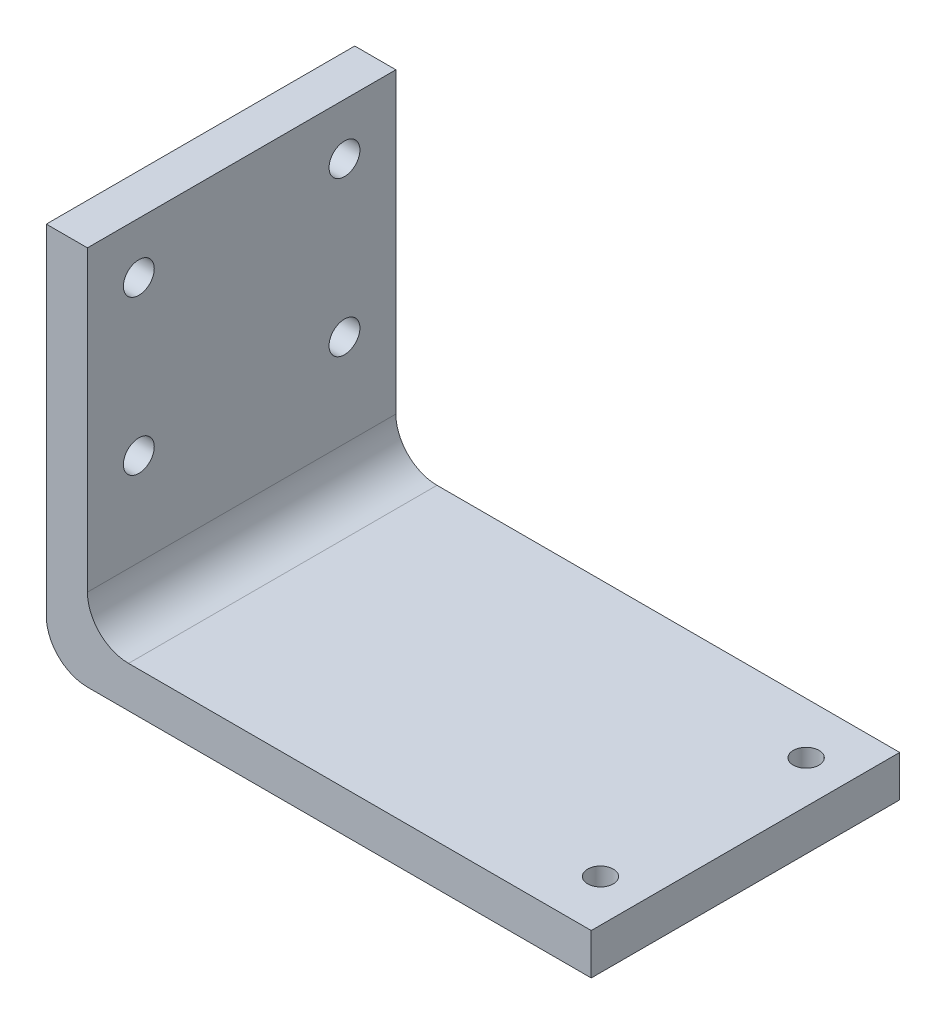
ISO-10303-21;
HEADER;
FILE_DESCRIPTION(('STEP AP214'),'2;1');
FILE_NAME('part.step','',(''),(''),'','','');
FILE_SCHEMA(('AUTOMOTIVE_DESIGN { 1 0 10303 214 1 1 1 1 }'));
ENDSEC;
DATA;
#1=APPLICATION_CONTEXT('core data for automotive mechanical design processes');
#2=APPLICATION_PROTOCOL_DEFINITION('international standard','automotive_design',2000,#1);
#3=PRODUCT_CONTEXT('',#1,'mechanical');
#4=PRODUCT('Part','Part','',(#3));
#5=PRODUCT_RELATED_PRODUCT_CATEGORY('part','',(#4));
#6=PRODUCT_DEFINITION_FORMATION('','',#4);
#7=PRODUCT_DEFINITION_CONTEXT('part definition',#1,'design');
#8=PRODUCT_DEFINITION('design','',#6,#7);
#9=PRODUCT_DEFINITION_SHAPE('','',#8);
#10=(LENGTH_UNIT() NAMED_UNIT(*) SI_UNIT(.MILLI.,.METRE.));
#11=(NAMED_UNIT(*) PLANE_ANGLE_UNIT() SI_UNIT($,.RADIAN.));
#12=(NAMED_UNIT(*) SI_UNIT($,.STERADIAN.) SOLID_ANGLE_UNIT());
#13=UNCERTAINTY_MEASURE_WITH_UNIT(LENGTH_MEASURE(1.E-05),#10,'distance_accuracy_value','');
#14=(GEOMETRIC_REPRESENTATION_CONTEXT(3) GLOBAL_UNCERTAINTY_ASSIGNED_CONTEXT((#13)) GLOBAL_UNIT_ASSIGNED_CONTEXT((#10,
#11,#12)) REPRESENTATION_CONTEXT('',''));
#15=CARTESIAN_POINT('',(0.,0.,0.));
#16=DIRECTION('',(0.,0.,1.));
#17=DIRECTION('',(1.,0.,0.));
#18=AXIS2_PLACEMENT_3D('',#15,#16,#17);
#19=CARTESIAN_POINT('',(67.31,0.,38.1));
#20=DIRECTION('',(-1.,0.,0.));
#21=DIRECTION('',(0.,0.,1.));
#22=AXIS2_PLACEMENT_3D('',#19,#20,#21);
#23=PLANE('',#22);
#24=DIRECTION('',(0.,1.,0.));
#25=VECTOR('',#24,1.);
#26=CARTESIAN_POINT('',(67.31,0.,0.));
#27=LINE('',#26,#25);
#28=CARTESIAN_POINT('',(67.31,0.,0.));
#29=VERTEX_POINT('',#28);
#30=CARTESIAN_POINT('',(67.31,5.08,0.));
#31=VERTEX_POINT('',#30);
#32=EDGE_CURVE('E140',#29,#31,#27,.T.);
#33=ORIENTED_EDGE('',*,*,#32,.T.);
#34=DIRECTION('',(0.,0.,-1.));
#35=VECTOR('',#34,1.);
#36=CARTESIAN_POINT('',(67.31,5.08,38.1));
#37=LINE('',#36,#35);
#38=CARTESIAN_POINT('',(67.31,5.08,38.1));
#39=VERTEX_POINT('',#38);
#40=EDGE_CURVE('E11',#39,#31,#37,.T.);
#41=ORIENTED_EDGE('',*,*,#40,.F.);
#42=DIRECTION('',(0.,1.,0.));
#43=VECTOR('',#42,1.);
#44=CARTESIAN_POINT('',(67.31,0.,38.1));
#45=LINE('',#44,#43);
#46=CARTESIAN_POINT('',(67.31,0.,38.1));
#47=VERTEX_POINT('',#46);
#48=EDGE_CURVE('E163',#47,#39,#45,.T.);
#49=ORIENTED_EDGE('',*,*,#48,.F.);
#50=DIRECTION('',(0.,0.,-1.));
#51=VECTOR('',#50,1.);
#52=CARTESIAN_POINT('',(67.31,0.,38.1));
#53=LINE('',#52,#51);
#54=EDGE_CURVE('E136',#47,#29,#53,.T.);
#55=ORIENTED_EDGE('',*,*,#54,.T.);
#56=EDGE_LOOP('',(#33,#41,#49,#55));
#57=FACE_BOUND('',#56,.T.);
#58=ADVANCED_FACE('F39',(#57),#23,.F.);
#59=CARTESIAN_POINT('',(10.16,5.08,38.1));
#60=DIRECTION('',(0.,-1.,0.));
#61=DIRECTION('',(0.,0.,-1.));
#62=AXIS2_PLACEMENT_3D('',#59,#60,#61);
#63=PLANE('',#62);
#64=CARTESIAN_POINT('',(62.103,5.08,31.75));
#65=DIRECTION('',(0.,1.,0.));
#66=DIRECTION('',(0.,0.,1.));
#67=AXIS2_PLACEMENT_3D('',#64,#65,#66);
#68=CIRCLE('',#67,1.58750000000001);
#69=CARTESIAN_POINT('',(62.103,5.08,33.3375));
#70=VERTEX_POINT('',#69);
#71=EDGE_CURVE('E215',#70,#70,#68,.T.);
#72=ORIENTED_EDGE('',*,*,#71,.F.);
#73=EDGE_LOOP('',(#72));
#74=FACE_BOUND('',#73,.T.);
#75=CARTESIAN_POINT('',(62.103,5.08,6.35));
#76=DIRECTION('',(0.,1.,0.));
#77=DIRECTION('',(0.,0.,1.));
#78=AXIS2_PLACEMENT_3D('',#75,#76,#77);
#79=CIRCLE('',#78,1.58750000000001);
#80=CARTESIAN_POINT('',(62.103,5.08,7.93750000000001));
#81=VERTEX_POINT('',#80);
#82=EDGE_CURVE('E207',#81,#81,#79,.T.);
#83=ORIENTED_EDGE('',*,*,#82,.F.);
#84=EDGE_LOOP('',(#83));
#85=FACE_BOUND('',#84,.T.);
#86=DIRECTION('',(-1.,0.,0.));
#87=VECTOR('',#86,1.);
#88=CARTESIAN_POINT('',(10.16,5.08,0.));
#89=LINE('',#88,#87);
#90=CARTESIAN_POINT('',(10.16,5.08,0.));
#91=VERTEX_POINT('',#90);
#92=EDGE_CURVE('E144',#31,#91,#89,.T.);
#93=ORIENTED_EDGE('',*,*,#92,.T.);
#94=DIRECTION('',(0.,0.,-1.));
#95=VECTOR('',#94,1.);
#96=CARTESIAN_POINT('',(10.16,5.08,38.1));
#97=LINE('',#96,#95);
#98=CARTESIAN_POINT('',(10.16,5.08,38.1));
#99=VERTEX_POINT('',#98);
#100=EDGE_CURVE('E48',#99,#91,#97,.T.);
#101=ORIENTED_EDGE('',*,*,#100,.F.);
#102=DIRECTION('',(-1.,0.,0.));
#103=VECTOR('',#102,1.);
#104=CARTESIAN_POINT('',(10.16,5.08,38.1));
#105=LINE('',#104,#103);
#106=EDGE_CURVE('E99',#39,#99,#105,.T.);
#107=ORIENTED_EDGE('',*,*,#106,.F.);
#108=ORIENTED_EDGE('',*,*,#40,.T.);
#109=EDGE_LOOP('',(#93,#101,#107,#108));
#110=FACE_BOUND('',#109,.T.);
#111=ADVANCED_FACE('F283',(#74,#85,#110),#63,.F.);
#112=CARTESIAN_POINT('',(10.16,10.16,38.1));
#113=DIRECTION('',(0.,0.,-1.));
#114=DIRECTION('',(-1.,0.,0.));
#115=AXIS2_PLACEMENT_3D('',#112,#113,#114);
#116=CYLINDRICAL_SURFACE('',#115,5.08);
#117=CARTESIAN_POINT('',(10.16,10.16,0.));
#118=DIRECTION('',(0.,0.,-1.));
#119=DIRECTION('',(-1.,0.,0.));
#120=AXIS2_PLACEMENT_3D('',#117,#118,#119);
#121=CIRCLE('',#120,5.08);
#122=CARTESIAN_POINT('',(5.08,10.16,0.));
#123=VERTEX_POINT('',#122);
#124=EDGE_CURVE('E148',#91,#123,#121,.T.);
#125=ORIENTED_EDGE('',*,*,#124,.T.);
#126=DIRECTION('',(0.,0.,-1.));
#127=VECTOR('',#126,1.);
#128=CARTESIAN_POINT('',(5.08,10.16,38.1));
#129=LINE('',#128,#127);
#130=CARTESIAN_POINT('',(5.08,10.16,38.1));
#131=VERTEX_POINT('',#130);
#132=EDGE_CURVE('E174',#131,#123,#129,.T.);
#133=ORIENTED_EDGE('',*,*,#132,.F.);
#134=CARTESIAN_POINT('',(10.16,10.16,38.1));
#135=DIRECTION('',(0.,0.,-1.));
#136=DIRECTION('',(-1.,0.,0.));
#137=AXIS2_PLACEMENT_3D('',#134,#135,#136);
#138=CIRCLE('',#137,5.08);
#139=EDGE_CURVE('E184',#99,#131,#138,.T.);
#140=ORIENTED_EDGE('',*,*,#139,.F.);
#141=ORIENTED_EDGE('',*,*,#100,.T.);
#142=EDGE_LOOP('',(#125,#133,#140,#141));
#143=FACE_BOUND('',#142,.T.);
#144=ADVANCED_FACE('F182',(#143),#116,.F.);
#145=CARTESIAN_POINT('',(5.08,10.16,38.1));
#146=DIRECTION('',(-1.,0.,0.));
#147=DIRECTION('',(0.,0.,1.));
#148=AXIS2_PLACEMENT_3D('',#145,#146,#147);
#149=PLANE('',#148);
#150=CARTESIAN_POINT('',(5.08,40.64,31.75));
#151=DIRECTION('',(1.,0.,0.));
#152=DIRECTION('',(0.,0.,-1.));
#153=AXIS2_PLACEMENT_3D('',#150,#151,#152);
#154=CIRCLE('',#153,1.905);
#155=CARTESIAN_POINT('',(5.08,40.64,29.845));
#156=VERTEX_POINT('',#155);
#157=EDGE_CURVE('E247',#156,#156,#154,.T.);
#158=ORIENTED_EDGE('',*,*,#157,.F.);
#159=EDGE_LOOP('',(#158));
#160=FACE_BOUND('',#159,.T.);
#161=CARTESIAN_POINT('',(5.08,40.64,6.35));
#162=DIRECTION('',(1.,0.,0.));
#163=DIRECTION('',(0.,0.,-1.));
#164=AXIS2_PLACEMENT_3D('',#161,#162,#163);
#165=CIRCLE('',#164,1.905);
#166=CARTESIAN_POINT('',(5.08,40.64,4.445));
#167=VERTEX_POINT('',#166);
#168=EDGE_CURVE('E239',#167,#167,#165,.T.);
#169=ORIENTED_EDGE('',*,*,#168,.F.);
#170=EDGE_LOOP('',(#169));
#171=FACE_BOUND('',#170,.T.);
#172=CARTESIAN_POINT('',(5.08,21.59,6.35));
#173=DIRECTION('',(1.,0.,0.));
#174=DIRECTION('',(0.,0.,-1.));
#175=AXIS2_PLACEMENT_3D('',#172,#173,#174);
#176=CIRCLE('',#175,1.905);
#177=CARTESIAN_POINT('',(5.08,21.59,4.445));
#178=VERTEX_POINT('',#177);
#179=EDGE_CURVE('E231',#178,#178,#176,.T.);
#180=ORIENTED_EDGE('',*,*,#179,.F.);
#181=EDGE_LOOP('',(#180));
#182=FACE_BOUND('',#181,.T.);
#183=CARTESIAN_POINT('',(5.08,21.59,31.75));
#184=DIRECTION('',(1.,0.,0.));
#185=DIRECTION('',(0.,0.,-1.));
#186=AXIS2_PLACEMENT_3D('',#183,#184,#185);
#187=CIRCLE('',#186,1.905);
#188=CARTESIAN_POINT('',(5.08,21.59,29.845));
#189=VERTEX_POINT('',#188);
#190=EDGE_CURVE('E223',#189,#189,#187,.T.);
#191=ORIENTED_EDGE('',*,*,#190,.F.);
#192=EDGE_LOOP('',(#191));
#193=FACE_BOUND('',#192,.T.);
#194=DIRECTION('',(0.,1.,0.));
#195=VECTOR('',#194,1.);
#196=CARTESIAN_POINT('',(5.08,10.16,0.));
#197=LINE('',#196,#195);
#198=CARTESIAN_POINT('',(5.08,46.99,0.));
#199=VERTEX_POINT('',#198);
#200=EDGE_CURVE('E151',#123,#199,#197,.T.);
#201=ORIENTED_EDGE('',*,*,#200,.T.);
#202=DIRECTION('',(0.,0.,-1.));
#203=VECTOR('',#202,1.);
#204=CARTESIAN_POINT('',(5.08,46.99,38.1));
#205=LINE('',#204,#203);
#206=CARTESIAN_POINT('',(5.08,46.99,38.1));
#207=VERTEX_POINT('',#206);
#208=EDGE_CURVE('E170',#207,#199,#205,.T.);
#209=ORIENTED_EDGE('',*,*,#208,.F.);
#210=DIRECTION('',(0.,1.,0.));
#211=VECTOR('',#210,1.);
#212=CARTESIAN_POINT('',(5.08,10.16,38.1));
#213=LINE('',#212,#211);
#214=EDGE_CURVE('E197',#131,#207,#213,.T.);
#215=ORIENTED_EDGE('',*,*,#214,.F.);
#216=ORIENTED_EDGE('',*,*,#132,.T.);
#217=EDGE_LOOP('',(#201,#209,#215,#216));
#218=FACE_BOUND('',#217,.T.);
#219=ADVANCED_FACE('F192',(#160,#171,#182,#193,#218),#149,.F.);
#220=CARTESIAN_POINT('',(0.,46.99,38.1));
#221=DIRECTION('',(0.,-1.,0.));
#222=DIRECTION('',(1.,0.,0.));
#223=AXIS2_PLACEMENT_3D('',#220,#221,#222);
#224=PLANE('',#223);
#225=DIRECTION('',(-1.,0.,0.));
#226=VECTOR('',#225,1.);
#227=CARTESIAN_POINT('',(0.,46.99,0.));
#228=LINE('',#227,#226);
#229=CARTESIAN_POINT('',(0.,46.99,0.));
#230=VERTEX_POINT('',#229);
#231=EDGE_CURVE('E154',#199,#230,#228,.T.);
#232=ORIENTED_EDGE('',*,*,#231,.T.);
#233=DIRECTION('',(0.,0.,-1.));
#234=VECTOR('',#233,1.);
#235=CARTESIAN_POINT('',(0.,46.99,38.1));
#236=LINE('',#235,#234);
#237=CARTESIAN_POINT('',(0.,46.99,38.1));
#238=VERTEX_POINT('',#237);
#239=EDGE_CURVE('E129',#238,#230,#236,.T.);
#240=ORIENTED_EDGE('',*,*,#239,.F.);
#241=DIRECTION('',(-1.,0.,0.));
#242=VECTOR('',#241,1.);
#243=CARTESIAN_POINT('',(0.,46.99,38.1));
#244=LINE('',#243,#242);
#245=EDGE_CURVE('E118',#207,#238,#244,.T.);
#246=ORIENTED_EDGE('',*,*,#245,.F.);
#247=ORIENTED_EDGE('',*,*,#208,.T.);
#248=EDGE_LOOP('',(#232,#240,#246,#247));
#249=FACE_BOUND('',#248,.T.);
#250=ADVANCED_FACE('F195',(#249),#224,.F.);
#251=CARTESIAN_POINT('',(0.,5.08000000000004,38.1));
#252=DIRECTION('',(1.,0.,0.));
#253=DIRECTION('',(0.,0.,-1.));
#254=AXIS2_PLACEMENT_3D('',#251,#252,#253);
#255=PLANE('',#254);
#256=CARTESIAN_POINT('',(0.,40.64,31.75));
#257=DIRECTION('',(1.,0.,0.));
#258=DIRECTION('',(0.,0.,-1.));
#259=AXIS2_PLACEMENT_3D('',#256,#257,#258);
#260=CIRCLE('',#259,1.905);
#261=CARTESIAN_POINT('',(0.,40.64,29.845));
#262=VERTEX_POINT('',#261);
#263=EDGE_CURVE('E243',#262,#262,#260,.F.);
#264=ORIENTED_EDGE('',*,*,#263,.F.);
#265=EDGE_LOOP('',(#264));
#266=FACE_BOUND('',#265,.T.);
#267=CARTESIAN_POINT('',(0.,40.64,6.35));
#268=DIRECTION('',(1.,0.,0.));
#269=DIRECTION('',(0.,0.,-1.));
#270=AXIS2_PLACEMENT_3D('',#267,#268,#269);
#271=CIRCLE('',#270,1.905);
#272=CARTESIAN_POINT('',(0.,40.64,4.445));
#273=VERTEX_POINT('',#272);
#274=EDGE_CURVE('E235',#273,#273,#271,.F.);
#275=ORIENTED_EDGE('',*,*,#274,.F.);
#276=EDGE_LOOP('',(#275));
#277=FACE_BOUND('',#276,.T.);
#278=CARTESIAN_POINT('',(0.,21.59,6.35));
#279=DIRECTION('',(1.,0.,0.));
#280=DIRECTION('',(0.,0.,-1.));
#281=AXIS2_PLACEMENT_3D('',#278,#279,#280);
#282=CIRCLE('',#281,1.905);
#283=CARTESIAN_POINT('',(0.,21.59,4.445));
#284=VERTEX_POINT('',#283);
#285=EDGE_CURVE('E227',#284,#284,#282,.F.);
#286=ORIENTED_EDGE('',*,*,#285,.F.);
#287=EDGE_LOOP('',(#286));
#288=FACE_BOUND('',#287,.T.);
#289=CARTESIAN_POINT('',(0.,21.59,31.75));
#290=DIRECTION('',(1.,0.,0.));
#291=DIRECTION('',(0.,0.,-1.));
#292=AXIS2_PLACEMENT_3D('',#289,#290,#291);
#293=CIRCLE('',#292,1.905);
#294=CARTESIAN_POINT('',(0.,21.59,29.845));
#295=VERTEX_POINT('',#294);
#296=EDGE_CURVE('E219',#295,#295,#293,.F.);
#297=ORIENTED_EDGE('',*,*,#296,.F.);
#298=EDGE_LOOP('',(#297));
#299=FACE_BOUND('',#298,.T.);
#300=DIRECTION('',(0.,-1.,0.));
#301=VECTOR('',#300,1.);
#302=CARTESIAN_POINT('',(0.,5.08000000000004,0.));
#303=LINE('',#302,#301);
#304=CARTESIAN_POINT('',(0.,5.08000000000004,0.));
#305=VERTEX_POINT('',#304);
#306=EDGE_CURVE('E127',#230,#305,#303,.T.);
#307=ORIENTED_EDGE('',*,*,#306,.T.);
#308=DIRECTION('',(0.,0.,-1.));
#309=VECTOR('',#308,1.);
#310=CARTESIAN_POINT('',(0.,5.08000000000004,38.1));
#311=LINE('',#310,#309);
#312=CARTESIAN_POINT('',(0.,5.08000000000004,38.1));
#313=VERTEX_POINT('',#312);
#314=EDGE_CURVE('E124',#313,#305,#311,.T.);
#315=ORIENTED_EDGE('',*,*,#314,.F.);
#316=DIRECTION('',(0.,-1.,0.));
#317=VECTOR('',#316,1.);
#318=CARTESIAN_POINT('',(0.,5.08000000000004,38.1));
#319=LINE('',#318,#317);
#320=EDGE_CURVE('E112',#238,#313,#319,.T.);
#321=ORIENTED_EDGE('',*,*,#320,.F.);
#322=ORIENTED_EDGE('',*,*,#239,.T.);
#323=EDGE_LOOP('',(#307,#315,#321,#322));
#324=FACE_BOUND('',#323,.T.);
#325=ADVANCED_FACE('F125',(#266,#277,#288,#299,#324),#255,.F.);
#326=CARTESIAN_POINT('',(5.08,5.08,38.1));
#327=DIRECTION('',(0.,0.,-1.));
#328=DIRECTION('',(-1.,0.,0.));
#329=AXIS2_PLACEMENT_3D('',#326,#327,#328);
#330=CYLINDRICAL_SURFACE('',#329,5.08);
#331=CARTESIAN_POINT('',(5.08,5.08,0.));
#332=DIRECTION('',(0.,0.,1.));
#333=DIRECTION('',(1.,0.,0.));
#334=AXIS2_PLACEMENT_3D('',#331,#332,#333);
#335=CIRCLE('',#334,5.08);
#336=CARTESIAN_POINT('',(5.08000000000004,0.,0.));
#337=VERTEX_POINT('',#336);
#338=EDGE_CURVE('E85',#305,#337,#335,.T.);
#339=ORIENTED_EDGE('',*,*,#338,.T.);
#340=DIRECTION('',(0.,0.,-1.));
#341=VECTOR('',#340,1.);
#342=CARTESIAN_POINT('',(5.08000000000004,0.,38.1));
#343=LINE('',#342,#341);
#344=CARTESIAN_POINT('',(5.08000000000004,0.,38.1));
#345=VERTEX_POINT('',#344);
#346=EDGE_CURVE('E130',#345,#337,#343,.T.);
#347=ORIENTED_EDGE('',*,*,#346,.F.);
#348=CARTESIAN_POINT('',(5.08,5.08,38.1));
#349=DIRECTION('',(0.,0.,1.));
#350=DIRECTION('',(1.,0.,0.));
#351=AXIS2_PLACEMENT_3D('',#348,#349,#350);
#352=CIRCLE('',#351,5.08);
#353=EDGE_CURVE('E116',#313,#345,#352,.T.);
#354=ORIENTED_EDGE('',*,*,#353,.F.);
#355=ORIENTED_EDGE('',*,*,#314,.T.);
#356=EDGE_LOOP('',(#339,#347,#354,#355));
#357=FACE_BOUND('',#356,.T.);
#358=ADVANCED_FACE('F132',(#357),#330,.T.);
#359=CARTESIAN_POINT('',(5.08000000000004,0.,38.1));
#360=DIRECTION('',(0.,1.,0.));
#361=DIRECTION('',(0.,0.,1.));
#362=AXIS2_PLACEMENT_3D('',#359,#360,#361);
#363=PLANE('',#362);
#364=CARTESIAN_POINT('',(62.103,0.,31.75));
#365=DIRECTION('',(0.,1.,0.));
#366=DIRECTION('',(0.,0.,1.));
#367=AXIS2_PLACEMENT_3D('',#364,#365,#366);
#368=CIRCLE('',#367,1.58750000000001);
#369=CARTESIAN_POINT('',(62.103,0.,33.3375));
#370=VERTEX_POINT('',#369);
#371=EDGE_CURVE('E211',#370,#370,#368,.F.);
#372=ORIENTED_EDGE('',*,*,#371,.F.);
#373=EDGE_LOOP('',(#372));
#374=FACE_BOUND('',#373,.T.);
#375=CARTESIAN_POINT('',(62.103,0.,6.35));
#376=DIRECTION('',(0.,1.,0.));
#377=DIRECTION('',(0.,0.,1.));
#378=AXIS2_PLACEMENT_3D('',#375,#376,#377);
#379=CIRCLE('',#378,1.58750000000001);
#380=CARTESIAN_POINT('',(62.103,0.,7.93750000000001));
#381=VERTEX_POINT('',#380);
#382=EDGE_CURVE('E145',#381,#381,#379,.F.);
#383=ORIENTED_EDGE('',*,*,#382,.F.);
#384=EDGE_LOOP('',(#383));
#385=FACE_BOUND('',#384,.T.);
#386=DIRECTION('',(1.,0.,0.));
#387=VECTOR('',#386,1.);
#388=CARTESIAN_POINT('',(5.08000000000004,0.,0.));
#389=LINE('',#388,#387);
#390=EDGE_CURVE('E91',#337,#29,#389,.T.);
#391=ORIENTED_EDGE('',*,*,#390,.T.);
#392=ORIENTED_EDGE('',*,*,#54,.F.);
#393=DIRECTION('',(1.,0.,0.));
#394=VECTOR('',#393,1.);
#395=CARTESIAN_POINT('',(5.08000000000004,0.,38.1));
#396=LINE('',#395,#394);
#397=EDGE_CURVE('E56',#345,#47,#396,.T.);
#398=ORIENTED_EDGE('',*,*,#397,.F.);
#399=ORIENTED_EDGE('',*,*,#346,.T.);
#400=EDGE_LOOP('',(#391,#392,#398,#399));
#401=FACE_BOUND('',#400,.T.);
#402=ADVANCED_FACE('F295',(#374,#385,#401),#363,.F.);
#403=CARTESIAN_POINT('',(10.16,10.16,38.1));
#404=DIRECTION('',(0.,0.,-1.));
#405=DIRECTION('',(-1.,0.,0.));
#406=AXIS2_PLACEMENT_3D('',#403,#404,#405);
#407=PLANE('',#406);
#408=ORIENTED_EDGE('',*,*,#48,.T.);
#409=ORIENTED_EDGE('',*,*,#106,.T.);
#410=ORIENTED_EDGE('',*,*,#139,.T.);
#411=ORIENTED_EDGE('',*,*,#214,.T.);
#412=ORIENTED_EDGE('',*,*,#245,.T.);
#413=ORIENTED_EDGE('',*,*,#320,.T.);
#414=ORIENTED_EDGE('',*,*,#353,.T.);
#415=ORIENTED_EDGE('',*,*,#397,.T.);
#416=EDGE_LOOP('',(#408,#409,#410,#411,#412,#413,#414,#415));
#417=FACE_BOUND('',#416,.T.);
#418=ADVANCED_FACE('F114',(#417),#407,.F.);
#419=CARTESIAN_POINT('',(10.16,10.16,0.));
#420=DIRECTION('',(0.,0.,-1.));
#421=DIRECTION('',(-1.,0.,0.));
#422=AXIS2_PLACEMENT_3D('',#419,#420,#421);
#423=PLANE('',#422);
#424=ORIENTED_EDGE('',*,*,#32,.F.);
#425=ORIENTED_EDGE('',*,*,#390,.F.);
#426=ORIENTED_EDGE('',*,*,#338,.F.);
#427=ORIENTED_EDGE('',*,*,#306,.F.);
#428=ORIENTED_EDGE('',*,*,#231,.F.);
#429=ORIENTED_EDGE('',*,*,#200,.F.);
#430=ORIENTED_EDGE('',*,*,#124,.F.);
#431=ORIENTED_EDGE('',*,*,#92,.F.);
#432=EDGE_LOOP('',(#424,#425,#426,#427,#428,#429,#430,#431));
#433=FACE_BOUND('',#432,.T.);
#434=ADVANCED_FACE('F188',(#433),#423,.T.);
#435=CARTESIAN_POINT('',(62.103,5.08,6.35));
#436=DIRECTION('',(0.,1.,0.));
#437=DIRECTION('',(0.,0.,1.));
#438=AXIS2_PLACEMENT_3D('',#435,#436,#437);
#439=CYLINDRICAL_SURFACE('',#438,1.58750000000001);
#440=ORIENTED_EDGE('',*,*,#382,.T.);
#441=EDGE_LOOP('',(#440));
#442=FACE_BOUND('',#441,.T.);
#443=ORIENTED_EDGE('',*,*,#82,.T.);
#444=EDGE_LOOP('',(#443));
#445=FACE_BOUND('',#444,.T.);
#446=ADVANCED_FACE('F309',(#442,#445),#439,.F.);
#447=CARTESIAN_POINT('',(62.103,5.08,31.75));
#448=DIRECTION('',(0.,1.,0.));
#449=DIRECTION('',(0.,0.,1.));
#450=AXIS2_PLACEMENT_3D('',#447,#448,#449);
#451=CYLINDRICAL_SURFACE('',#450,1.58750000000001);
#452=ORIENTED_EDGE('',*,*,#371,.T.);
#453=EDGE_LOOP('',(#452));
#454=FACE_BOUND('',#453,.T.);
#455=ORIENTED_EDGE('',*,*,#71,.T.);
#456=EDGE_LOOP('',(#455));
#457=FACE_BOUND('',#456,.T.);
#458=ADVANCED_FACE('F271',(#454,#457),#451,.F.);
#459=CARTESIAN_POINT('',(5.08,21.59,31.75));
#460=DIRECTION('',(1.,0.,0.));
#461=DIRECTION('',(0.,0.,-1.));
#462=AXIS2_PLACEMENT_3D('',#459,#460,#461);
#463=CYLINDRICAL_SURFACE('',#462,1.905);
#464=ORIENTED_EDGE('',*,*,#296,.T.);
#465=EDGE_LOOP('',(#464));
#466=FACE_BOUND('',#465,.T.);
#467=ORIENTED_EDGE('',*,*,#190,.T.);
#468=EDGE_LOOP('',(#467));
#469=FACE_BOUND('',#468,.T.);
#470=ADVANCED_FACE('F267',(#466,#469),#463,.F.);
#471=CARTESIAN_POINT('',(5.08,21.59,6.35));
#472=DIRECTION('',(1.,0.,0.));
#473=DIRECTION('',(0.,0.,-1.));
#474=AXIS2_PLACEMENT_3D('',#471,#472,#473);
#475=CYLINDRICAL_SURFACE('',#474,1.905);
#476=ORIENTED_EDGE('',*,*,#285,.T.);
#477=EDGE_LOOP('',(#476));
#478=FACE_BOUND('',#477,.T.);
#479=ORIENTED_EDGE('',*,*,#179,.T.);
#480=EDGE_LOOP('',(#479));
#481=FACE_BOUND('',#480,.T.);
#482=ADVANCED_FACE('F270',(#478,#481),#475,.F.);
#483=CARTESIAN_POINT('',(5.08,40.64,6.35));
#484=DIRECTION('',(1.,0.,0.));
#485=DIRECTION('',(0.,0.,-1.));
#486=AXIS2_PLACEMENT_3D('',#483,#484,#485);
#487=CYLINDRICAL_SURFACE('',#486,1.905);
#488=ORIENTED_EDGE('',*,*,#274,.T.);
#489=EDGE_LOOP('',(#488));
#490=FACE_BOUND('',#489,.T.);
#491=ORIENTED_EDGE('',*,*,#168,.T.);
#492=EDGE_LOOP('',(#491));
#493=FACE_BOUND('',#492,.T.);
#494=ADVANCED_FACE('F319',(#490,#493),#487,.F.);
#495=CARTESIAN_POINT('',(5.08,40.64,31.75));
#496=DIRECTION('',(1.,0.,0.));
#497=DIRECTION('',(0.,0.,-1.));
#498=AXIS2_PLACEMENT_3D('',#495,#496,#497);
#499=CYLINDRICAL_SURFACE('',#498,1.905);
#500=ORIENTED_EDGE('',*,*,#263,.T.);
#501=EDGE_LOOP('',(#500));
#502=FACE_BOUND('',#501,.T.);
#503=ORIENTED_EDGE('',*,*,#157,.T.);
#504=EDGE_LOOP('',(#503));
#505=FACE_BOUND('',#504,.T.);
#506=ADVANCED_FACE('F255',(#502,#505),#499,.F.);
#507=CLOSED_SHELL('',(#58,#111,#144,#219,#250,#325,#358,#402,#418,#434,#446,#458,#470,#482,#494,#506));
#508=MANIFOLD_SOLID_BREP('B2',#507);
#509=ADVANCED_BREP_SHAPE_REPRESENTATION('',(#18,#508),#14);
#510=SHAPE_DEFINITION_REPRESENTATION(#9,#509);
ENDSEC;
END-ISO-10303-21;
